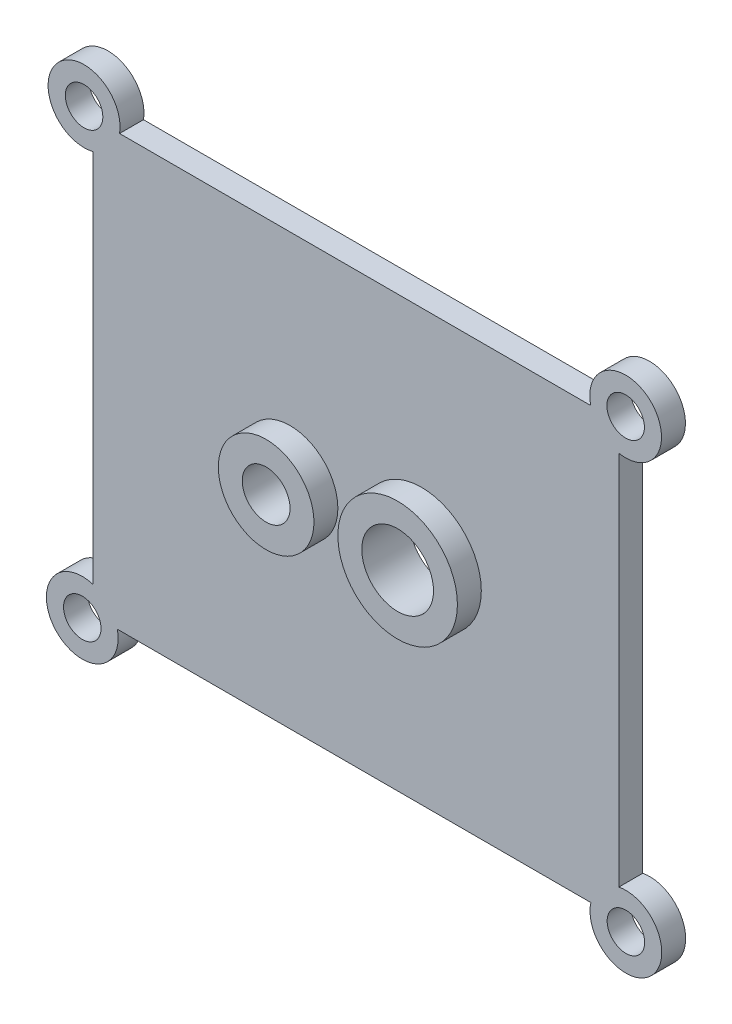
ISO-10303-21;
HEADER;
FILE_DESCRIPTION(('STEP AP214'),'2;1');
FILE_NAME('part.step','',(''),(''),'','','');
FILE_SCHEMA(('AUTOMOTIVE_DESIGN { 1 0 10303 214 1 1 1 1 }'));
ENDSEC;
DATA;
#1=APPLICATION_CONTEXT('core data for automotive mechanical design processes');
#2=APPLICATION_PROTOCOL_DEFINITION('international standard','automotive_design',2000,#1);
#3=PRODUCT_CONTEXT('',#1,'mechanical');
#4=PRODUCT('Part','Part','',(#3));
#5=PRODUCT_RELATED_PRODUCT_CATEGORY('part','',(#4));
#6=PRODUCT_DEFINITION_FORMATION('','',#4);
#7=PRODUCT_DEFINITION_CONTEXT('part definition',#1,'design');
#8=PRODUCT_DEFINITION('design','',#6,#7);
#9=PRODUCT_DEFINITION_SHAPE('','',#8);
#10=(LENGTH_UNIT() NAMED_UNIT(*) SI_UNIT(.MILLI.,.METRE.));
#11=(NAMED_UNIT(*) PLANE_ANGLE_UNIT() SI_UNIT($,.RADIAN.));
#12=(NAMED_UNIT(*) SI_UNIT($,.STERADIAN.) SOLID_ANGLE_UNIT());
#13=UNCERTAINTY_MEASURE_WITH_UNIT(LENGTH_MEASURE(1.E-05),#10,'distance_accuracy_value','');
#14=(GEOMETRIC_REPRESENTATION_CONTEXT(3) GLOBAL_UNCERTAINTY_ASSIGNED_CONTEXT((#13)) GLOBAL_UNIT_ASSIGNED_CONTEXT((#10,
#11,#12)) REPRESENTATION_CONTEXT('',''));
#15=CARTESIAN_POINT('',(0.,0.,0.));
#16=DIRECTION('',(0.,0.,1.));
#17=DIRECTION('',(1.,0.,0.));
#18=AXIS2_PLACEMENT_3D('',#15,#16,#17);
#19=CARTESIAN_POINT('',(34.925,-28.575,3.175));
#20=DIRECTION('',(-1.,0.,0.));
#21=DIRECTION('',(0.,0.,1.));
#22=AXIS2_PLACEMENT_3D('',#19,#20,#21);
#23=PLANE('',#22);
#24=DIRECTION('',(0.,1.,0.));
#25=VECTOR('',#24,1.);
#26=CARTESIAN_POINT('',(34.925,-28.575,3.175));
#27=LINE('',#26,#25);
#28=CARTESIAN_POINT('',(34.925,-24.9397895282315,3.175));
#29=VERTEX_POINT('',#28);
#30=CARTESIAN_POINT('',(34.925,24.9617511410447,3.175));
#31=VERTEX_POINT('',#30);
#32=EDGE_CURVE('E141',#29,#31,#27,.T.);
#33=ORIENTED_EDGE('',*,*,#32,.F.);
#34=DIRECTION('',(0.,0.,1.));
#35=VECTOR('',#34,1.);
#36=CARTESIAN_POINT('',(34.925,-24.9397895282315,0.));
#37=LINE('',#36,#35);
#38=CARTESIAN_POINT('',(34.925,-24.9397895282315,0.));
#39=VERTEX_POINT('',#38);
#40=EDGE_CURVE('E151',#29,#39,#37,.F.);
#41=ORIENTED_EDGE('',*,*,#40,.T.);
#42=DIRECTION('',(0.,1.,0.));
#43=VECTOR('',#42,1.);
#44=CARTESIAN_POINT('',(34.925,-28.575,0.));
#45=LINE('',#44,#43);
#46=CARTESIAN_POINT('',(34.925,24.9617511410447,0.));
#47=VERTEX_POINT('',#46);
#48=EDGE_CURVE('E129',#39,#47,#45,.T.);
#49=ORIENTED_EDGE('',*,*,#48,.T.);
#50=DIRECTION('',(0.,0.,1.));
#51=VECTOR('',#50,1.);
#52=CARTESIAN_POINT('',(34.925,24.9617511410447,0.));
#53=LINE('',#52,#51);
#54=EDGE_CURVE('E156',#47,#31,#53,.T.);
#55=ORIENTED_EDGE('',*,*,#54,.T.);
#56=EDGE_LOOP('',(#33,#41,#49,#55));
#57=FACE_BOUND('',#56,.T.);
#58=ADVANCED_FACE('F39',(#57),#23,.F.);
#59=CARTESIAN_POINT('',(-34.925,28.575,3.175));
#60=DIRECTION('',(0.,-1.,0.));
#61=DIRECTION('',(0.,0.,-1.));
#62=AXIS2_PLACEMENT_3D('',#59,#60,#61);
#63=PLANE('',#62);
#64=DIRECTION('',(-1.,0.,0.));
#65=VECTOR('',#64,1.);
#66=CARTESIAN_POINT('',(-34.925,28.575,3.175));
#67=LINE('',#66,#65);
#68=CARTESIAN_POINT('',(31.1900740487613,28.575,3.175));
#69=VERTEX_POINT('',#68);
#70=CARTESIAN_POINT('',(-31.3690603976613,28.575,3.175));
#71=VERTEX_POINT('',#70);
#72=EDGE_CURVE('E143',#69,#71,#67,.T.);
#73=ORIENTED_EDGE('',*,*,#72,.F.);
#74=DIRECTION('',(0.,0.,1.));
#75=VECTOR('',#74,1.);
#76=CARTESIAN_POINT('',(31.1900740487613,28.575,0.));
#77=LINE('',#76,#75);
#78=CARTESIAN_POINT('',(31.1900740487613,28.575,0.));
#79=VERTEX_POINT('',#78);
#80=EDGE_CURVE('E113',#69,#79,#77,.F.);
#81=ORIENTED_EDGE('',*,*,#80,.T.);
#82=DIRECTION('',(-1.,0.,0.));
#83=VECTOR('',#82,1.);
#84=CARTESIAN_POINT('',(-34.925,28.575,0.));
#85=LINE('',#84,#83);
#86=CARTESIAN_POINT('',(-31.3690603976613,28.575,0.));
#87=VERTEX_POINT('',#86);
#88=EDGE_CURVE('E124',#79,#87,#85,.T.);
#89=ORIENTED_EDGE('',*,*,#88,.T.);
#90=DIRECTION('',(0.,0.,1.));
#91=VECTOR('',#90,1.);
#92=CARTESIAN_POINT('',(-31.3690603976613,28.575,0.));
#93=LINE('',#92,#91);
#94=EDGE_CURVE('E102',#87,#71,#93,.T.);
#95=ORIENTED_EDGE('',*,*,#94,.T.);
#96=EDGE_LOOP('',(#73,#81,#89,#95));
#97=FACE_BOUND('',#96,.T.);
#98=ADVANCED_FACE('F126',(#97),#63,.F.);
#99=CARTESIAN_POINT('',(-34.925,-28.575,3.175));
#100=DIRECTION('',(1.,0.,0.));
#101=DIRECTION('',(0.,0.,-1.));
#102=AXIS2_PLACEMENT_3D('',#99,#100,#101);
#103=PLANE('',#102);
#104=DIRECTION('',(0.,-1.,0.));
#105=VECTOR('',#104,1.);
#106=CARTESIAN_POINT('',(-34.925,-28.575,0.));
#107=LINE('',#106,#105);
#108=CARTESIAN_POINT('',(-34.925,24.7247104116703,0.));
#109=VERTEX_POINT('',#108);
#110=CARTESIAN_POINT('',(-34.925,-25.0375604846747,0.));
#111=VERTEX_POINT('',#110);
#112=EDGE_CURVE('E127',#109,#111,#107,.T.);
#113=ORIENTED_EDGE('',*,*,#112,.T.);
#114=DIRECTION('',(0.,0.,1.));
#115=VECTOR('',#114,1.);
#116=CARTESIAN_POINT('',(-34.925,-25.0375604846747,0.));
#117=LINE('',#116,#115);
#118=CARTESIAN_POINT('',(-34.925,-25.0375604846747,3.175));
#119=VERTEX_POINT('',#118);
#120=EDGE_CURVE('E131',#111,#119,#117,.T.);
#121=ORIENTED_EDGE('',*,*,#120,.T.);
#122=DIRECTION('',(0.,-1.,0.));
#123=VECTOR('',#122,1.);
#124=CARTESIAN_POINT('',(-34.925,-28.575,3.175));
#125=LINE('',#124,#123);
#126=CARTESIAN_POINT('',(-34.925,24.7247104116703,3.175));
#127=VERTEX_POINT('',#126);
#128=EDGE_CURVE('E139',#127,#119,#125,.T.);
#129=ORIENTED_EDGE('',*,*,#128,.F.);
#130=DIRECTION('',(0.,0.,1.));
#131=VECTOR('',#130,1.);
#132=CARTESIAN_POINT('',(-34.925,24.7247104116703,0.));
#133=LINE('',#132,#131);
#134=EDGE_CURVE('E119',#127,#109,#133,.F.);
#135=ORIENTED_EDGE('',*,*,#134,.T.);
#136=EDGE_LOOP('',(#113,#121,#129,#135));
#137=FACE_BOUND('',#136,.T.);
#138=ADVANCED_FACE('F261',(#137),#103,.F.);
#139=CARTESIAN_POINT('',(-34.925,-28.575,3.175));
#140=DIRECTION('',(0.,1.,0.));
#141=DIRECTION('',(0.,0.,1.));
#142=AXIS2_PLACEMENT_3D('',#139,#140,#141);
#143=PLANE('',#142);
#144=DIRECTION('',(1.,0.,0.));
#145=VECTOR('',#144,1.);
#146=CARTESIAN_POINT('',(-34.925,-28.575,3.175));
#147=LINE('',#146,#145);
#148=CARTESIAN_POINT('',(-31.6690390316661,-28.575,3.175));
#149=VERTEX_POINT('',#148);
#150=CARTESIAN_POINT('',(31.2158026670803,-28.575,3.175));
#151=VERTEX_POINT('',#150);
#152=EDGE_CURVE('E132',#149,#151,#147,.T.);
#153=ORIENTED_EDGE('',*,*,#152,.F.);
#154=DIRECTION('',(0.,0.,1.));
#155=VECTOR('',#154,1.);
#156=CARTESIAN_POINT('',(-31.6690390316661,-28.575,0.));
#157=LINE('',#156,#155);
#158=CARTESIAN_POINT('',(-31.6690390316661,-28.575,0.));
#159=VERTEX_POINT('',#158);
#160=EDGE_CURVE('E146',#149,#159,#157,.F.);
#161=ORIENTED_EDGE('',*,*,#160,.T.);
#162=DIRECTION('',(1.,0.,0.));
#163=VECTOR('',#162,1.);
#164=CARTESIAN_POINT('',(-34.925,-28.575,0.));
#165=LINE('',#164,#163);
#166=CARTESIAN_POINT('',(31.2158026670803,-28.575,0.));
#167=VERTEX_POINT('',#166);
#168=EDGE_CURVE('E45',#159,#167,#165,.T.);
#169=ORIENTED_EDGE('',*,*,#168,.T.);
#170=DIRECTION('',(0.,0.,1.));
#171=VECTOR('',#170,1.);
#172=CARTESIAN_POINT('',(31.2158026670803,-28.575,0.));
#173=LINE('',#172,#171);
#174=EDGE_CURVE('E152',#167,#151,#173,.T.);
#175=ORIENTED_EDGE('',*,*,#174,.T.);
#176=EDGE_LOOP('',(#153,#161,#169,#175));
#177=FACE_BOUND('',#176,.T.);
#178=ADVANCED_FACE('F236',(#177),#143,.F.);
#179=CARTESIAN_POINT('',(0.,0.,3.175));
#180=DIRECTION('',(0.,0.,-1.));
#181=DIRECTION('',(-1.,0.,0.));
#182=AXIS2_PLACEMENT_3D('',#179,#180,#181);
#183=PLANE('',#182);
#184=CARTESIAN_POINT('',(-8.73125,-0.0391062591255484,3.175));
#185=DIRECTION('',(0.,0.,1.));
#186=DIRECTION('',(1.,0.,0.));
#187=AXIS2_PLACEMENT_3D('',#184,#185,#186);
#188=CIRCLE('',#187,6.35);
#189=CARTESIAN_POINT('',(-2.38125,-0.0391062591255484,3.175));
#190=VERTEX_POINT('',#189);
#191=EDGE_CURVE('E11',#190,#190,#188,.T.);
#192=ORIENTED_EDGE('',*,*,#191,.F.);
#193=EDGE_LOOP('',(#192));
#194=FACE_BOUND('',#193,.T.);
#195=CARTESIAN_POINT('',(8.73125,0.00274520160164354,3.175));
#196=DIRECTION('',(0.,0.,1.));
#197=DIRECTION('',(1.,0.,0.));
#198=AXIS2_PLACEMENT_3D('',#195,#196,#197);
#199=CIRCLE('',#198,7.9375);
#200=CARTESIAN_POINT('',(16.66875,0.00274520160164354,3.175));
#201=VERTEX_POINT('',#200);
#202=EDGE_CURVE('E50',#201,#201,#199,.T.);
#203=ORIENTED_EDGE('',*,*,#202,.F.);
#204=EDGE_LOOP('',(#203));
#205=FACE_BOUND('',#204,.T.);
#206=CARTESIAN_POINT('',(-36.322,-29.5905591943165,3.175));
#207=DIRECTION('',(0.,0.,1.));
#208=DIRECTION('',(1.,0.,0.));
#209=AXIS2_PLACEMENT_3D('',#206,#207,#208);
#210=CIRCLE('',#209,2.4892);
#211=CARTESIAN_POINT('',(-33.8328,-29.5905591943165,3.175));
#212=VERTEX_POINT('',#211);
#213=EDGE_CURVE('E184',#212,#212,#210,.T.);
#214=ORIENTED_EDGE('',*,*,#213,.F.);
#215=EDGE_LOOP('',(#214));
#216=FACE_BOUND('',#215,.T.);
#217=CARTESIAN_POINT('',(35.8647791179222,-29.6086460755585,3.175));
#218=DIRECTION('',(0.,0.,1.));
#219=DIRECTION('',(1.,0.,0.));
#220=AXIS2_PLACEMENT_3D('',#217,#218,#219);
#221=CIRCLE('',#220,2.4892);
#222=CARTESIAN_POINT('',(38.3539791179222,-29.6086460755585,3.175));
#223=VERTEX_POINT('',#222);
#224=EDGE_CURVE('E191',#223,#223,#221,.T.);
#225=ORIENTED_EDGE('',*,*,#224,.F.);
#226=EDGE_LOOP('',(#225));
#227=FACE_BOUND('',#226,.T.);
#228=CARTESIAN_POINT('',(35.8326653027773,29.6369570133175,3.175));
#229=DIRECTION('',(0.,0.,1.));
#230=DIRECTION('',(1.,0.,0.));
#231=AXIS2_PLACEMENT_3D('',#228,#229,#230);
#232=CIRCLE('',#231,2.4892);
#233=CARTESIAN_POINT('',(38.3218653027772,29.6369570133175,3.175));
#234=VERTEX_POINT('',#233);
#235=EDGE_CURVE('E179',#234,#234,#232,.T.);
#236=ORIENTED_EDGE('',*,*,#235,.F.);
#237=EDGE_LOOP('',(#236));
#238=FACE_BOUND('',#237,.T.);
#239=CARTESIAN_POINT('',(-36.0809444494494,29.3594752576004,3.175));
#240=DIRECTION('',(0.,0.,1.));
#241=DIRECTION('',(1.,0.,0.));
#242=AXIS2_PLACEMENT_3D('',#239,#240,#241);
#243=CIRCLE('',#242,2.4892);
#244=CARTESIAN_POINT('',(-33.5917444494494,29.3594752576004,3.175));
#245=VERTEX_POINT('',#244);
#246=EDGE_CURVE('E172',#245,#245,#243,.T.);
#247=ORIENTED_EDGE('',*,*,#246,.F.);
#248=EDGE_LOOP('',(#247));
#249=FACE_BOUND('',#248,.T.);
#250=CARTESIAN_POINT('',(35.8647791179222,-29.6086460755585,3.175));
#251=DIRECTION('',(0.,0.,1.));
#252=DIRECTION('',(1.,0.,0.));
#253=AXIS2_PLACEMENT_3D('',#250,#251,#252);
#254=CIRCLE('',#253,4.7625);
#255=EDGE_CURVE('E54',#151,#29,#254,.T.);
#256=ORIENTED_EDGE('',*,*,#255,.T.);
#257=ORIENTED_EDGE('',*,*,#32,.T.);
#258=CARTESIAN_POINT('',(35.8326653027773,29.6369570133175,3.175));
#259=DIRECTION('',(0.,0.,1.));
#260=DIRECTION('',(1.,0.,0.));
#261=AXIS2_PLACEMENT_3D('',#258,#259,#260);
#262=CIRCLE('',#261,4.7625);
#263=EDGE_CURVE('E161',#31,#69,#262,.T.);
#264=ORIENTED_EDGE('',*,*,#263,.T.);
#265=ORIENTED_EDGE('',*,*,#72,.T.);
#266=CARTESIAN_POINT('',(-36.0809444494494,29.3594752576004,3.175));
#267=DIRECTION('',(0.,0.,1.));
#268=DIRECTION('',(1.,0.,0.));
#269=AXIS2_PLACEMENT_3D('',#266,#267,#268);
#270=CIRCLE('',#269,4.77674080804911);
#271=EDGE_CURVE('E109',#71,#127,#270,.T.);
#272=ORIENTED_EDGE('',*,*,#271,.T.);
#273=ORIENTED_EDGE('',*,*,#128,.T.);
#274=CARTESIAN_POINT('',(-36.322,-29.5905591943165,3.175));
#275=DIRECTION('',(0.,0.,1.));
#276=DIRECTION('',(1.,0.,0.));
#277=AXIS2_PLACEMENT_3D('',#274,#275,#276);
#278=CIRCLE('',#277,4.7625);
#279=EDGE_CURVE('E164',#119,#149,#278,.T.);
#280=ORIENTED_EDGE('',*,*,#279,.T.);
#281=ORIENTED_EDGE('',*,*,#152,.T.);
#282=EDGE_LOOP('',(#256,#257,#264,#265,#272,#273,#280,#281));
#283=FACE_BOUND('',#282,.T.);
#284=ADVANCED_FACE('F235',(#194,#205,#216,#227,#238,#249,#283),#183,.F.);
#285=CARTESIAN_POINT('',(0.,0.,0.));
#286=DIRECTION('',(0.,0.,-1.));
#287=DIRECTION('',(-1.,0.,0.));
#288=AXIS2_PLACEMENT_3D('',#285,#286,#287);
#289=PLANE('',#288);
#290=CARTESIAN_POINT('',(-8.73125,-0.0391062591255484,0.));
#291=DIRECTION('',(0.,0.,1.));
#292=DIRECTION('',(1.,0.,0.));
#293=AXIS2_PLACEMENT_3D('',#290,#291,#292);
#294=CIRCLE('',#293,3.175);
#295=CARTESIAN_POINT('',(-5.55625,-0.0391062591255484,0.));
#296=VERTEX_POINT('',#295);
#297=EDGE_CURVE('E183',#296,#296,#294,.T.);
#298=ORIENTED_EDGE('',*,*,#297,.T.);
#299=EDGE_LOOP('',(#298));
#300=FACE_BOUND('',#299,.T.);
#301=CARTESIAN_POINT('',(8.73125,0.00274520160164354,0.));
#302=DIRECTION('',(0.,0.,1.));
#303=DIRECTION('',(1.,0.,0.));
#304=AXIS2_PLACEMENT_3D('',#301,#302,#303);
#305=CIRCLE('',#304,4.7625);
#306=CARTESIAN_POINT('',(13.49375,0.00274520160164354,0.));
#307=VERTEX_POINT('',#306);
#308=EDGE_CURVE('E200',#307,#307,#305,.T.);
#309=ORIENTED_EDGE('',*,*,#308,.T.);
#310=EDGE_LOOP('',(#309));
#311=FACE_BOUND('',#310,.T.);
#312=CARTESIAN_POINT('',(-36.322,-29.5905591943165,0.));
#313=DIRECTION('',(0.,0.,1.));
#314=DIRECTION('',(1.,0.,0.));
#315=AXIS2_PLACEMENT_3D('',#312,#313,#314);
#316=CIRCLE('',#315,2.4892);
#317=CARTESIAN_POINT('',(-33.8328,-29.5905591943165,0.));
#318=VERTEX_POINT('',#317);
#319=EDGE_CURVE('E182',#318,#318,#316,.T.);
#320=ORIENTED_EDGE('',*,*,#319,.T.);
#321=EDGE_LOOP('',(#320));
#322=FACE_BOUND('',#321,.T.);
#323=CARTESIAN_POINT('',(35.8647791179222,-29.6086460755585,0.));
#324=DIRECTION('',(0.,0.,1.));
#325=DIRECTION('',(1.,0.,0.));
#326=AXIS2_PLACEMENT_3D('',#323,#324,#325);
#327=CIRCLE('',#326,2.4892);
#328=CARTESIAN_POINT('',(38.3539791179222,-29.6086460755585,0.));
#329=VERTEX_POINT('',#328);
#330=EDGE_CURVE('E190',#329,#329,#327,.T.);
#331=ORIENTED_EDGE('',*,*,#330,.T.);
#332=EDGE_LOOP('',(#331));
#333=FACE_BOUND('',#332,.T.);
#334=CARTESIAN_POINT('',(35.8326653027773,29.6369570133175,0.));
#335=DIRECTION('',(0.,0.,1.));
#336=DIRECTION('',(1.,0.,0.));
#337=AXIS2_PLACEMENT_3D('',#334,#335,#336);
#338=CIRCLE('',#337,2.4892);
#339=CARTESIAN_POINT('',(38.3218653027772,29.6369570133175,0.));
#340=VERTEX_POINT('',#339);
#341=EDGE_CURVE('E193',#340,#340,#338,.T.);
#342=ORIENTED_EDGE('',*,*,#341,.T.);
#343=EDGE_LOOP('',(#342));
#344=FACE_BOUND('',#343,.T.);
#345=CARTESIAN_POINT('',(-36.0809444494494,29.3594752576004,0.));
#346=DIRECTION('',(0.,0.,1.));
#347=DIRECTION('',(1.,0.,0.));
#348=AXIS2_PLACEMENT_3D('',#345,#346,#347);
#349=CIRCLE('',#348,2.4892);
#350=CARTESIAN_POINT('',(-33.5917444494494,29.3594752576004,0.));
#351=VERTEX_POINT('',#350);
#352=EDGE_CURVE('E167',#351,#351,#349,.T.);
#353=ORIENTED_EDGE('',*,*,#352,.T.);
#354=EDGE_LOOP('',(#353));
#355=FACE_BOUND('',#354,.T.);
#356=ORIENTED_EDGE('',*,*,#168,.F.);
#357=CARTESIAN_POINT('',(-36.322,-29.5905591943165,0.));
#358=DIRECTION('',(0.,0.,1.));
#359=DIRECTION('',(1.,0.,0.));
#360=AXIS2_PLACEMENT_3D('',#357,#358,#359);
#361=CIRCLE('',#360,4.7625);
#362=EDGE_CURVE('E162',#111,#159,#361,.T.);
#363=ORIENTED_EDGE('',*,*,#362,.F.);
#364=ORIENTED_EDGE('',*,*,#112,.F.);
#365=CARTESIAN_POINT('',(-36.0809444494494,29.3594752576004,0.));
#366=DIRECTION('',(0.,0.,1.));
#367=DIRECTION('',(1.,0.,0.));
#368=AXIS2_PLACEMENT_3D('',#365,#366,#367);
#369=CIRCLE('',#368,4.77674080804911);
#370=EDGE_CURVE('E110',#87,#109,#369,.T.);
#371=ORIENTED_EDGE('',*,*,#370,.F.);
#372=ORIENTED_EDGE('',*,*,#88,.F.);
#373=CARTESIAN_POINT('',(35.8326653027773,29.6369570133175,0.));
#374=DIRECTION('',(0.,0.,1.));
#375=DIRECTION('',(1.,0.,0.));
#376=AXIS2_PLACEMENT_3D('',#373,#374,#375);
#377=CIRCLE('',#376,4.7625);
#378=EDGE_CURVE('E65',#47,#79,#377,.T.);
#379=ORIENTED_EDGE('',*,*,#378,.F.);
#380=ORIENTED_EDGE('',*,*,#48,.F.);
#381=CARTESIAN_POINT('',(35.8647791179222,-29.6086460755585,0.));
#382=DIRECTION('',(0.,0.,1.));
#383=DIRECTION('',(1.,0.,0.));
#384=AXIS2_PLACEMENT_3D('',#381,#382,#383);
#385=CIRCLE('',#384,4.7625);
#386=EDGE_CURVE('E166',#167,#39,#385,.T.);
#387=ORIENTED_EDGE('',*,*,#386,.F.);
#388=EDGE_LOOP('',(#356,#363,#364,#371,#372,#379,#380,#387));
#389=FACE_BOUND('',#388,.T.);
#390=ADVANCED_FACE('F122',(#300,#311,#322,#333,#344,#355,#389),#289,.T.);
#391=CARTESIAN_POINT('',(35.8647791179222,-29.6086460755585,0.));
#392=DIRECTION('',(0.,0.,1.));
#393=DIRECTION('',(1.,0.,0.));
#394=AXIS2_PLACEMENT_3D('',#391,#392,#393);
#395=CYLINDRICAL_SURFACE('',#394,4.7625);
#396=ORIENTED_EDGE('',*,*,#40,.F.);
#397=ORIENTED_EDGE('',*,*,#255,.F.);
#398=ORIENTED_EDGE('',*,*,#174,.F.);
#399=ORIENTED_EDGE('',*,*,#386,.T.);
#400=EDGE_LOOP('',(#396,#397,#398,#399));
#401=FACE_BOUND('',#400,.T.);
#402=ADVANCED_FACE('F307',(#401),#395,.T.);
#403=CARTESIAN_POINT('',(-36.322,-29.5905591943165,0.));
#404=DIRECTION('',(0.,0.,1.));
#405=DIRECTION('',(1.,0.,0.));
#406=AXIS2_PLACEMENT_3D('',#403,#404,#405);
#407=CYLINDRICAL_SURFACE('',#406,4.7625);
#408=ORIENTED_EDGE('',*,*,#120,.F.);
#409=ORIENTED_EDGE('',*,*,#362,.T.);
#410=ORIENTED_EDGE('',*,*,#160,.F.);
#411=ORIENTED_EDGE('',*,*,#279,.F.);
#412=EDGE_LOOP('',(#408,#409,#410,#411));
#413=FACE_BOUND('',#412,.T.);
#414=ADVANCED_FACE('F256',(#413),#407,.T.);
#415=CARTESIAN_POINT('',(-36.0809444494494,29.3594752576004,0.));
#416=DIRECTION('',(0.,0.,1.));
#417=DIRECTION('',(1.,0.,0.));
#418=AXIS2_PLACEMENT_3D('',#415,#416,#417);
#419=CYLINDRICAL_SURFACE('',#418,4.77674080804911);
#420=ORIENTED_EDGE('',*,*,#94,.F.);
#421=ORIENTED_EDGE('',*,*,#370,.T.);
#422=ORIENTED_EDGE('',*,*,#134,.F.);
#423=ORIENTED_EDGE('',*,*,#271,.F.);
#424=EDGE_LOOP('',(#420,#421,#422,#423));
#425=FACE_BOUND('',#424,.T.);
#426=ADVANCED_FACE('F106',(#425),#419,.T.);
#427=CARTESIAN_POINT('',(35.8326653027773,29.6369570133175,0.));
#428=DIRECTION('',(0.,0.,1.));
#429=DIRECTION('',(1.,0.,0.));
#430=AXIS2_PLACEMENT_3D('',#427,#428,#429);
#431=CYLINDRICAL_SURFACE('',#430,4.7625);
#432=ORIENTED_EDGE('',*,*,#54,.F.);
#433=ORIENTED_EDGE('',*,*,#378,.T.);
#434=ORIENTED_EDGE('',*,*,#80,.F.);
#435=ORIENTED_EDGE('',*,*,#263,.F.);
#436=EDGE_LOOP('',(#432,#433,#434,#435));
#437=FACE_BOUND('',#436,.T.);
#438=ADVANCED_FACE('F251',(#437),#431,.T.);
#439=CARTESIAN_POINT('',(-36.0809444494494,29.3594752576004,0.));
#440=DIRECTION('',(0.,0.,1.));
#441=DIRECTION('',(1.,0.,0.));
#442=AXIS2_PLACEMENT_3D('',#439,#440,#441);
#443=CYLINDRICAL_SURFACE('',#442,2.4892);
#444=ORIENTED_EDGE('',*,*,#352,.F.);
#445=EDGE_LOOP('',(#444));
#446=FACE_BOUND('',#445,.T.);
#447=ORIENTED_EDGE('',*,*,#246,.T.);
#448=EDGE_LOOP('',(#447));
#449=FACE_BOUND('',#448,.T.);
#450=ADVANCED_FACE('F409',(#446,#449),#443,.F.);
#451=CARTESIAN_POINT('',(35.8326653027773,29.6369570133175,0.));
#452=DIRECTION('',(0.,0.,1.));
#453=DIRECTION('',(1.,0.,0.));
#454=AXIS2_PLACEMENT_3D('',#451,#452,#453);
#455=CYLINDRICAL_SURFACE('',#454,2.4892);
#456=ORIENTED_EDGE('',*,*,#341,.F.);
#457=EDGE_LOOP('',(#456));
#458=FACE_BOUND('',#457,.T.);
#459=ORIENTED_EDGE('',*,*,#235,.T.);
#460=EDGE_LOOP('',(#459));
#461=FACE_BOUND('',#460,.T.);
#462=ADVANCED_FACE('F397',(#458,#461),#455,.F.);
#463=CARTESIAN_POINT('',(35.8647791179222,-29.6086460755585,0.));
#464=DIRECTION('',(0.,0.,1.));
#465=DIRECTION('',(1.,0.,0.));
#466=AXIS2_PLACEMENT_3D('',#463,#464,#465);
#467=CYLINDRICAL_SURFACE('',#466,2.4892);
#468=ORIENTED_EDGE('',*,*,#330,.F.);
#469=EDGE_LOOP('',(#468));
#470=FACE_BOUND('',#469,.T.);
#471=ORIENTED_EDGE('',*,*,#224,.T.);
#472=EDGE_LOOP('',(#471));
#473=FACE_BOUND('',#472,.T.);
#474=ADVANCED_FACE('F389',(#470,#473),#467,.F.);
#475=CARTESIAN_POINT('',(-36.322,-29.5905591943165,0.));
#476=DIRECTION('',(0.,0.,1.));
#477=DIRECTION('',(1.,0.,0.));
#478=AXIS2_PLACEMENT_3D('',#475,#476,#477);
#479=CYLINDRICAL_SURFACE('',#478,2.4892);
#480=ORIENTED_EDGE('',*,*,#319,.F.);
#481=EDGE_LOOP('',(#480));
#482=FACE_BOUND('',#481,.T.);
#483=ORIENTED_EDGE('',*,*,#213,.T.);
#484=EDGE_LOOP('',(#483));
#485=FACE_BOUND('',#484,.T.);
#486=ADVANCED_FACE('F346',(#482,#485),#479,.F.);
#487=CARTESIAN_POINT('',(8.73125,0.00274520160164354,0.));
#488=DIRECTION('',(0.,0.,1.));
#489=DIRECTION('',(1.,0.,0.));
#490=AXIS2_PLACEMENT_3D('',#487,#488,#489);
#491=CYLINDRICAL_SURFACE('',#490,4.7625);
#492=ORIENTED_EDGE('',*,*,#308,.F.);
#493=EDGE_LOOP('',(#492));
#494=FACE_BOUND('',#493,.T.);
#495=CARTESIAN_POINT('',(8.73125,0.00274520160164354,6.35));
#496=DIRECTION('',(0.,0.,1.));
#497=DIRECTION('',(1.,0.,0.));
#498=AXIS2_PLACEMENT_3D('',#495,#496,#497);
#499=CIRCLE('',#498,4.7625);
#500=CARTESIAN_POINT('',(13.49375,0.00274520160164354,6.35));
#501=VERTEX_POINT('',#500);
#502=EDGE_CURVE('E208',#501,#501,#499,.T.);
#503=ORIENTED_EDGE('',*,*,#502,.T.);
#504=EDGE_LOOP('',(#503));
#505=FACE_BOUND('',#504,.T.);
#506=ADVANCED_FACE('F218',(#494,#505),#491,.F.);
#507=CARTESIAN_POINT('',(-8.73125,-0.0391062591255484,0.));
#508=DIRECTION('',(0.,0.,1.));
#509=DIRECTION('',(1.,0.,0.));
#510=AXIS2_PLACEMENT_3D('',#507,#508,#509);
#511=CYLINDRICAL_SURFACE('',#510,3.175);
#512=ORIENTED_EDGE('',*,*,#297,.F.);
#513=EDGE_LOOP('',(#512));
#514=FACE_BOUND('',#513,.T.);
#515=CARTESIAN_POINT('',(-8.73125,-0.0391062591255484,6.35));
#516=DIRECTION('',(0.,0.,1.));
#517=DIRECTION('',(1.,0.,0.));
#518=AXIS2_PLACEMENT_3D('',#515,#516,#517);
#519=CIRCLE('',#518,3.175);
#520=CARTESIAN_POINT('',(-5.55625,-0.0391062591255484,6.35));
#521=VERTEX_POINT('',#520);
#522=EDGE_CURVE('E213',#521,#521,#519,.T.);
#523=ORIENTED_EDGE('',*,*,#522,.T.);
#524=EDGE_LOOP('',(#523));
#525=FACE_BOUND('',#524,.T.);
#526=ADVANCED_FACE('F223',(#514,#525),#511,.F.);
#527=CARTESIAN_POINT('',(8.73125,0.00274520160164354,6.35));
#528=DIRECTION('',(0.,0.,1.));
#529=DIRECTION('',(1.,0.,0.));
#530=AXIS2_PLACEMENT_3D('',#527,#528,#529);
#531=PLANE('',#530);
#532=ORIENTED_EDGE('',*,*,#502,.F.);
#533=EDGE_LOOP('',(#532));
#534=FACE_BOUND('',#533,.T.);
#535=CARTESIAN_POINT('',(8.73125,0.00274520160164354,6.35));
#536=DIRECTION('',(0.,0.,1.));
#537=DIRECTION('',(1.,0.,0.));
#538=AXIS2_PLACEMENT_3D('',#535,#536,#537);
#539=CIRCLE('',#538,7.9375);
#540=CARTESIAN_POINT('',(16.66875,0.00274520160164354,6.35));
#541=VERTEX_POINT('',#540);
#542=EDGE_CURVE('E202',#541,#541,#539,.T.);
#543=ORIENTED_EDGE('',*,*,#542,.T.);
#544=EDGE_LOOP('',(#543));
#545=FACE_BOUND('',#544,.T.);
#546=ADVANCED_FACE('F222',(#534,#545),#531,.T.);
#547=CARTESIAN_POINT('',(8.73125,0.00274520160164354,6.35));
#548=DIRECTION('',(0.,0.,-1.));
#549=DIRECTION('',(-1.,0.,0.));
#550=AXIS2_PLACEMENT_3D('',#547,#548,#549);
#551=CYLINDRICAL_SURFACE('',#550,7.9375);
#552=ORIENTED_EDGE('',*,*,#542,.F.);
#553=EDGE_LOOP('',(#552));
#554=FACE_BOUND('',#553,.T.);
#555=ORIENTED_EDGE('',*,*,#202,.T.);
#556=EDGE_LOOP('',(#555));
#557=FACE_BOUND('',#556,.T.);
#558=ADVANCED_FACE('F221',(#554,#557),#551,.T.);
#559=CARTESIAN_POINT('',(-8.73125,-0.0391062591255484,6.35));
#560=DIRECTION('',(0.,0.,1.));
#561=DIRECTION('',(1.,0.,0.));
#562=AXIS2_PLACEMENT_3D('',#559,#560,#561);
#563=PLANE('',#562);
#564=ORIENTED_EDGE('',*,*,#522,.F.);
#565=EDGE_LOOP('',(#564));
#566=FACE_BOUND('',#565,.T.);
#567=CARTESIAN_POINT('',(-8.73125,-0.0391062591255484,6.35));
#568=DIRECTION('',(0.,0.,1.));
#569=DIRECTION('',(1.,0.,0.));
#570=AXIS2_PLACEMENT_3D('',#567,#568,#569);
#571=CIRCLE('',#570,6.35);
#572=CARTESIAN_POINT('',(-2.38125,-0.0391062591255484,6.35));
#573=VERTEX_POINT('',#572);
#574=EDGE_CURVE('E205',#573,#573,#571,.T.);
#575=ORIENTED_EDGE('',*,*,#574,.T.);
#576=EDGE_LOOP('',(#575));
#577=FACE_BOUND('',#576,.T.);
#578=ADVANCED_FACE('F231',(#566,#577),#563,.T.);
#579=CARTESIAN_POINT('',(-8.73125,-0.0391062591255484,6.35));
#580=DIRECTION('',(0.,0.,-1.));
#581=DIRECTION('',(-1.,0.,0.));
#582=AXIS2_PLACEMENT_3D('',#579,#580,#581);
#583=CYLINDRICAL_SURFACE('',#582,6.35);
#584=ORIENTED_EDGE('',*,*,#574,.F.);
#585=EDGE_LOOP('',(#584));
#586=FACE_BOUND('',#585,.T.);
#587=ORIENTED_EDGE('',*,*,#191,.T.);
#588=EDGE_LOOP('',(#587));
#589=FACE_BOUND('',#588,.T.);
#590=ADVANCED_FACE('F339',(#586,#589),#583,.T.);
#591=CLOSED_SHELL('',(#58,#98,#138,#178,#284,#390,#402,#414,#426,#438,#450,#462,#474,#486,#506,
#526,#546,#558,#578,#590));
#592=MANIFOLD_SOLID_BREP('B2',#591);
#593=ADVANCED_BREP_SHAPE_REPRESENTATION('',(#18,#592),#14);
#594=SHAPE_DEFINITION_REPRESENTATION(#9,#593);
ENDSEC;
END-ISO-10303-21;
